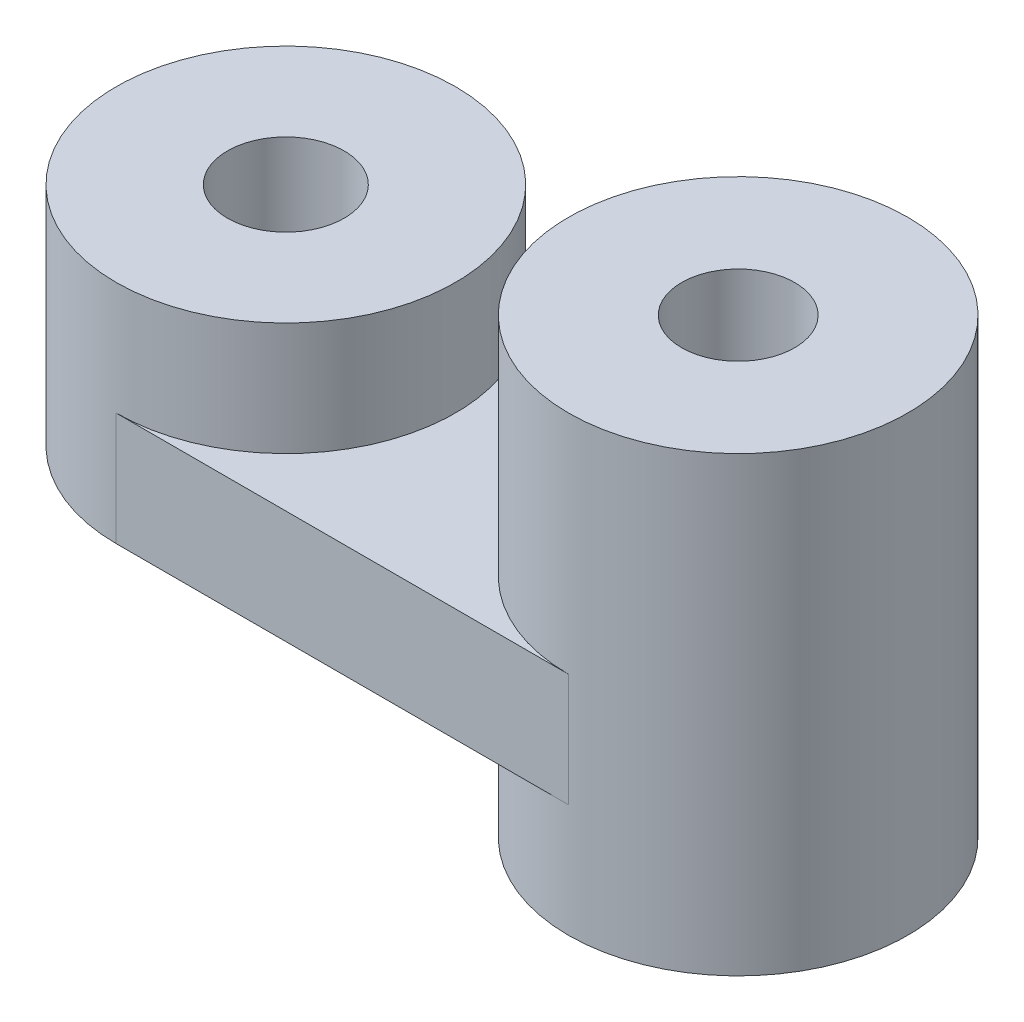
ISO-10303-21;
HEADER;
FILE_DESCRIPTION(('STEP AP214'),'2;1');
FILE_NAME('part.step','',(''),(''),'','','');
FILE_SCHEMA(('AUTOMOTIVE_DESIGN { 1 0 10303 214 1 1 1 1 }'));
ENDSEC;
DATA;
#1=APPLICATION_CONTEXT('core data for automotive mechanical design processes');
#2=APPLICATION_PROTOCOL_DEFINITION('international standard','automotive_design',2000,#1);
#3=PRODUCT_CONTEXT('',#1,'mechanical');
#4=PRODUCT('Part','Part','',(#3));
#5=PRODUCT_RELATED_PRODUCT_CATEGORY('part','',(#4));
#6=PRODUCT_DEFINITION_FORMATION('','',#4);
#7=PRODUCT_DEFINITION_CONTEXT('part definition',#1,'design');
#8=PRODUCT_DEFINITION('design','',#6,#7);
#9=PRODUCT_DEFINITION_SHAPE('','',#8);
#10=(LENGTH_UNIT() NAMED_UNIT(*) SI_UNIT(.MILLI.,.METRE.));
#11=(NAMED_UNIT(*) PLANE_ANGLE_UNIT() SI_UNIT($,.RADIAN.));
#12=(NAMED_UNIT(*) SI_UNIT($,.STERADIAN.) SOLID_ANGLE_UNIT());
#13=UNCERTAINTY_MEASURE_WITH_UNIT(LENGTH_MEASURE(1.E-05),#10,'distance_accuracy_value','');
#14=(GEOMETRIC_REPRESENTATION_CONTEXT(3) GLOBAL_UNCERTAINTY_ASSIGNED_CONTEXT((#13)) GLOBAL_UNIT_ASSIGNED_CONTEXT((#10,
#11,#12)) REPRESENTATION_CONTEXT('',''));
#15=CARTESIAN_POINT('',(0.,0.,0.));
#16=DIRECTION('',(0.,0.,1.));
#17=DIRECTION('',(1.,0.,0.));
#18=AXIS2_PLACEMENT_3D('',#15,#16,#17);
#19=CARTESIAN_POINT('',(0.,5.,0.));
#20=DIRECTION('',(0.,1.,0.));
#21=DIRECTION('',(0.,0.,1.));
#22=AXIS2_PLACEMENT_3D('',#19,#20,#21);
#23=PLANE('',#22);
#24=CARTESIAN_POINT('',(-10.,5.,0.));
#25=DIRECTION('',(0.,1.,0.));
#26=DIRECTION('',(0.,0.,1.));
#27=AXIS2_PLACEMENT_3D('',#24,#25,#26);
#28=CIRCLE('',#27,2.5);
#29=CARTESIAN_POINT('',(-10.,5.,2.5));
#30=VERTEX_POINT('',#29);
#31=EDGE_CURVE('E111',#30,#30,#28,.T.);
#32=ORIENTED_EDGE('',*,*,#31,.F.);
#33=EDGE_LOOP('',(#32));
#34=FACE_BOUND('',#33,.T.);
#35=CARTESIAN_POINT('',(-10.,5.,0.));
#36=DIRECTION('',(0.,1.,0.));
#37=DIRECTION('',(0.,0.,1.));
#38=AXIS2_PLACEMENT_3D('',#35,#36,#37);
#39=CIRCLE('',#38,2.58081611022788);
#40=CARTESIAN_POINT('',(-10.,5.,2.58081611022788));
#41=VERTEX_POINT('',#40);
#42=EDGE_CURVE('E144',#41,#41,#39,.T.);
#43=ORIENTED_EDGE('',*,*,#42,.T.);
#44=EDGE_LOOP('',(#43));
#45=FACE_BOUND('',#44,.T.);
#46=ADVANCED_FACE('F45',(#34,#45),#23,.T.);
#47=CARTESIAN_POINT('',(0.,5.,-7.5));
#48=DIRECTION('',(0.,0.,-1.));
#49=DIRECTION('',(-1.,0.,0.));
#50=AXIS2_PLACEMENT_3D('',#47,#48,#49);
#51=PLANE('',#50);
#52=DIRECTION('',(1.,0.,0.));
#53=VECTOR('',#52,1.);
#54=CARTESIAN_POINT('',(0.,0.,-7.5));
#55=LINE('',#54,#53);
#56=CARTESIAN_POINT('',(-10.,0.,-7.5));
#57=VERTEX_POINT('',#56);
#58=CARTESIAN_POINT('',(10.,0.,-7.5));
#59=VERTEX_POINT('',#58);
#60=EDGE_CURVE('E89',#57,#59,#55,.T.);
#61=ORIENTED_EDGE('',*,*,#60,.F.);
#62=DIRECTION('',(0.,-1.,0.));
#63=VECTOR('',#62,1.);
#64=CARTESIAN_POINT('',(-10.,5.,-7.5));
#65=LINE('',#64,#63);
#66=CARTESIAN_POINT('',(-10.,5.,-7.5));
#67=VERTEX_POINT('',#66);
#68=EDGE_CURVE('E55',#67,#57,#65,.T.);
#69=ORIENTED_EDGE('',*,*,#68,.F.);
#70=DIRECTION('',(1.,0.,0.));
#71=VECTOR('',#70,1.);
#72=CARTESIAN_POINT('',(0.,5.,-7.5));
#73=LINE('',#72,#71);
#74=CARTESIAN_POINT('',(10.,5.,-7.5));
#75=VERTEX_POINT('',#74);
#76=EDGE_CURVE('E134',#67,#75,#73,.T.);
#77=ORIENTED_EDGE('',*,*,#76,.T.);
#78=DIRECTION('',(0.,-1.,0.));
#79=VECTOR('',#78,1.);
#80=CARTESIAN_POINT('',(10.,5.,-7.5));
#81=LINE('',#80,#79);
#82=EDGE_CURVE('E106',#75,#59,#81,.T.);
#83=ORIENTED_EDGE('',*,*,#82,.T.);
#84=EDGE_LOOP('',(#61,#69,#77,#83));
#85=FACE_BOUND('',#84,.T.);
#86=ADVANCED_FACE('F47',(#85),#51,.T.);
#87=CARTESIAN_POINT('',(-10.,5.,0.));
#88=DIRECTION('',(0.,-1.,0.));
#89=DIRECTION('',(0.,0.,-1.));
#90=AXIS2_PLACEMENT_3D('',#87,#88,#89);
#91=CYLINDRICAL_SURFACE('',#90,7.5);
#92=CARTESIAN_POINT('',(-10.,0.,0.));
#93=DIRECTION('',(0.,1.,0.));
#94=DIRECTION('',(0.,0.,1.));
#95=AXIS2_PLACEMENT_3D('',#92,#93,#94);
#96=CIRCLE('',#95,7.5);
#97=CARTESIAN_POINT('',(-10.,0.,7.5));
#98=VERTEX_POINT('',#97);
#99=EDGE_CURVE('E77',#57,#98,#96,.T.);
#100=ORIENTED_EDGE('',*,*,#99,.T.);
#101=DIRECTION('',(0.,-1.,0.));
#102=VECTOR('',#101,1.);
#103=CARTESIAN_POINT('',(-10.,5.,7.5));
#104=LINE('',#103,#102);
#105=CARTESIAN_POINT('',(-10.,5.,7.5));
#106=VERTEX_POINT('',#105);
#107=EDGE_CURVE('E99',#106,#98,#104,.T.);
#108=ORIENTED_EDGE('',*,*,#107,.F.);
#109=CARTESIAN_POINT('',(-10.,5.,0.));
#110=DIRECTION('',(0.,1.,0.));
#111=DIRECTION('',(0.,0.,1.));
#112=AXIS2_PLACEMENT_3D('',#109,#110,#111);
#113=CIRCLE('',#112,7.5);
#114=EDGE_CURVE('E119',#106,#67,#113,.T.);
#115=ORIENTED_EDGE('',*,*,#114,.T.);
#116=ORIENTED_EDGE('',*,*,#68,.T.);
#117=EDGE_LOOP('',(#100,#108,#115,#116));
#118=FACE_BOUND('',#117,.T.);
#119=CARTESIAN_POINT('',(-10.,10.,0.));
#120=DIRECTION('',(0.,1.,0.));
#121=DIRECTION('',(0.,0.,1.));
#122=AXIS2_PLACEMENT_3D('',#119,#120,#121);
#123=CIRCLE('',#122,7.5);
#124=CARTESIAN_POINT('',(-10.,10.,7.5));
#125=VERTEX_POINT('',#124);
#126=EDGE_CURVE('E125',#125,#125,#123,.T.);
#127=ORIENTED_EDGE('',*,*,#126,.F.);
#128=EDGE_LOOP('',(#127));
#129=FACE_BOUND('',#128,.T.);
#130=ADVANCED_FACE('F116',(#118,#129),#91,.T.);
#131=CARTESIAN_POINT('',(0.,5.,7.5));
#132=DIRECTION('',(0.,0.,-1.));
#133=DIRECTION('',(-1.,0.,0.));
#134=AXIS2_PLACEMENT_3D('',#131,#132,#133);
#135=PLANE('',#134);
#136=DIRECTION('',(1.,0.,0.));
#137=VECTOR('',#136,1.);
#138=CARTESIAN_POINT('',(0.,0.,7.5));
#139=LINE('',#138,#137);
#140=CARTESIAN_POINT('',(10.,0.,7.5));
#141=VERTEX_POINT('',#140);
#142=EDGE_CURVE('E86',#98,#141,#139,.T.);
#143=ORIENTED_EDGE('',*,*,#142,.T.);
#144=DIRECTION('',(0.,-1.,0.));
#145=VECTOR('',#144,1.);
#146=CARTESIAN_POINT('',(10.,5.,7.5));
#147=LINE('',#146,#145);
#148=CARTESIAN_POINT('',(10.,5.,7.5));
#149=VERTEX_POINT('',#148);
#150=EDGE_CURVE('E98',#149,#141,#147,.T.);
#151=ORIENTED_EDGE('',*,*,#150,.F.);
#152=DIRECTION('',(1.,0.,0.));
#153=VECTOR('',#152,1.);
#154=CARTESIAN_POINT('',(0.,5.,7.5));
#155=LINE('',#154,#153);
#156=EDGE_CURVE('E137',#106,#149,#155,.T.);
#157=ORIENTED_EDGE('',*,*,#156,.F.);
#158=ORIENTED_EDGE('',*,*,#107,.T.);
#159=EDGE_LOOP('',(#143,#151,#157,#158));
#160=FACE_BOUND('',#159,.T.);
#161=ADVANCED_FACE('F95',(#160),#135,.F.);
#162=CARTESIAN_POINT('',(10.,5.,0.));
#163=DIRECTION('',(0.,-1.,0.));
#164=DIRECTION('',(0.,0.,-1.));
#165=AXIS2_PLACEMENT_3D('',#162,#163,#164);
#166=CYLINDRICAL_SURFACE('',#165,7.5);
#167=ORIENTED_EDGE('',*,*,#150,.T.);
#168=CARTESIAN_POINT('',(10.,0.,0.));
#169=DIRECTION('',(0.,1.,0.));
#170=DIRECTION('',(0.,0.,1.));
#171=AXIS2_PLACEMENT_3D('',#168,#169,#170);
#172=CIRCLE('',#171,7.5);
#173=EDGE_CURVE('E11',#59,#141,#172,.T.);
#174=ORIENTED_EDGE('',*,*,#173,.F.);
#175=ORIENTED_EDGE('',*,*,#82,.F.);
#176=CARTESIAN_POINT('',(10.,5.,0.));
#177=DIRECTION('',(0.,1.,0.));
#178=DIRECTION('',(0.,0.,1.));
#179=AXIS2_PLACEMENT_3D('',#176,#177,#178);
#180=CIRCLE('',#179,7.5);
#181=EDGE_CURVE('E63',#75,#149,#180,.T.);
#182=ORIENTED_EDGE('',*,*,#181,.T.);
#183=EDGE_LOOP('',(#167,#174,#175,#182));
#184=FACE_BOUND('',#183,.T.);
#185=CARTESIAN_POINT('',(10.,-5.,0.));
#186=DIRECTION('',(0.,1.,0.));
#187=DIRECTION('',(0.,0.,1.));
#188=AXIS2_PLACEMENT_3D('',#185,#186,#187);
#189=CIRCLE('',#188,7.5);
#190=CARTESIAN_POINT('',(10.,-5.,7.5));
#191=VERTEX_POINT('',#190);
#192=EDGE_CURVE('E153',#191,#191,#189,.T.);
#193=ORIENTED_EDGE('',*,*,#192,.T.);
#194=EDGE_LOOP('',(#193));
#195=FACE_BOUND('',#194,.T.);
#196=CARTESIAN_POINT('',(10.,15.,0.));
#197=DIRECTION('',(0.,1.,0.));
#198=DIRECTION('',(0.,0.,1.));
#199=AXIS2_PLACEMENT_3D('',#196,#197,#198);
#200=CIRCLE('',#199,7.5);
#201=CARTESIAN_POINT('',(10.,15.,7.5));
#202=VERTEX_POINT('',#201);
#203=EDGE_CURVE('E161',#202,#202,#200,.T.);
#204=ORIENTED_EDGE('',*,*,#203,.F.);
#205=EDGE_LOOP('',(#204));
#206=FACE_BOUND('',#205,.T.);
#207=ADVANCED_FACE('F103',(#184,#195,#206),#166,.T.);
#208=CARTESIAN_POINT('',(-10.,5.,0.));
#209=DIRECTION('',(0.,-1.,0.));
#210=DIRECTION('',(0.,0.,-1.));
#211=AXIS2_PLACEMENT_3D('',#208,#209,#210);
#212=CYLINDRICAL_SURFACE('',#211,2.5);
#213=ORIENTED_EDGE('',*,*,#31,.T.);
#214=EDGE_LOOP('',(#213));
#215=FACE_BOUND('',#214,.T.);
#216=CARTESIAN_POINT('',(-10.,0.,0.));
#217=DIRECTION('',(0.,1.,0.));
#218=DIRECTION('',(0.,0.,1.));
#219=AXIS2_PLACEMENT_3D('',#216,#217,#218);
#220=CIRCLE('',#219,2.5);
#221=CARTESIAN_POINT('',(-10.,0.,2.5));
#222=VERTEX_POINT('',#221);
#223=EDGE_CURVE('E101',#222,#222,#220,.T.);
#224=ORIENTED_EDGE('',*,*,#223,.F.);
#225=EDGE_LOOP('',(#224));
#226=FACE_BOUND('',#225,.T.);
#227=ADVANCED_FACE('F195',(#215,#226),#212,.F.);
#228=ORIENTED_EDGE('',*,*,#181,.F.);
#229=ORIENTED_EDGE('',*,*,#76,.F.);
#230=ORIENTED_EDGE('',*,*,#114,.F.);
#231=ORIENTED_EDGE('',*,*,#156,.T.);
#232=EDGE_LOOP('',(#228,#229,#230,#231));
#233=FACE_BOUND('',#232,.T.);
#234=ADVANCED_FACE('F186',(#233),#23,.T.);
#235=CARTESIAN_POINT('',(0.,0.,0.));
#236=DIRECTION('',(0.,1.,0.));
#237=DIRECTION('',(0.,0.,1.));
#238=AXIS2_PLACEMENT_3D('',#235,#236,#237);
#239=PLANE('',#238);
#240=ORIENTED_EDGE('',*,*,#60,.T.);
#241=ORIENTED_EDGE('',*,*,#173,.T.);
#242=ORIENTED_EDGE('',*,*,#142,.F.);
#243=ORIENTED_EDGE('',*,*,#99,.F.);
#244=EDGE_LOOP('',(#240,#241,#242,#243));
#245=FACE_BOUND('',#244,.T.);
#246=ORIENTED_EDGE('',*,*,#223,.T.);
#247=EDGE_LOOP('',(#246));
#248=FACE_BOUND('',#247,.T.);
#249=ADVANCED_FACE('F84',(#245,#248),#239,.F.);
#250=CARTESIAN_POINT('',(-10.,10.,0.));
#251=DIRECTION('',(0.,1.,0.));
#252=DIRECTION('',(0.,0.,1.));
#253=AXIS2_PLACEMENT_3D('',#250,#251,#252);
#254=PLANE('',#253);
#255=ORIENTED_EDGE('',*,*,#126,.T.);
#256=EDGE_LOOP('',(#255));
#257=FACE_BOUND('',#256,.T.);
#258=CARTESIAN_POINT('',(-10.,10.,0.));
#259=DIRECTION('',(0.,1.,0.));
#260=DIRECTION('',(0.,0.,1.));
#261=AXIS2_PLACEMENT_3D('',#258,#259,#260);
#262=CIRCLE('',#261,2.58081611022788);
#263=CARTESIAN_POINT('',(-10.,10.,2.58081611022788));
#264=VERTEX_POINT('',#263);
#265=EDGE_CURVE('E142',#264,#264,#262,.T.);
#266=ORIENTED_EDGE('',*,*,#265,.F.);
#267=EDGE_LOOP('',(#266));
#268=FACE_BOUND('',#267,.T.);
#269=ADVANCED_FACE('F200',(#257,#268),#254,.T.);
#270=CARTESIAN_POINT('',(-10.,10.,0.));
#271=DIRECTION('',(0.,-1.,0.));
#272=DIRECTION('',(0.,0.,-1.));
#273=AXIS2_PLACEMENT_3D('',#270,#271,#272);
#274=CYLINDRICAL_SURFACE('',#273,2.58081611022788);
#275=ORIENTED_EDGE('',*,*,#265,.T.);
#276=EDGE_LOOP('',(#275));
#277=FACE_BOUND('',#276,.T.);
#278=ORIENTED_EDGE('',*,*,#42,.F.);
#279=EDGE_LOOP('',(#278));
#280=FACE_BOUND('',#279,.T.);
#281=ADVANCED_FACE('F251',(#277,#280),#274,.F.);
#282=CARTESIAN_POINT('',(10.,-5.,0.));
#283=DIRECTION('',(0.,1.,0.));
#284=DIRECTION('',(0.,0.,1.));
#285=AXIS2_PLACEMENT_3D('',#282,#283,#284);
#286=PLANE('',#285);
#287=CARTESIAN_POINT('',(10.,-5.,0.));
#288=DIRECTION('',(0.,1.,0.));
#289=DIRECTION('',(0.,0.,1.));
#290=AXIS2_PLACEMENT_3D('',#287,#288,#289);
#291=CIRCLE('',#290,2.5);
#292=CARTESIAN_POINT('',(10.,-5.,2.5));
#293=VERTEX_POINT('',#292);
#294=EDGE_CURVE('E157',#293,#293,#291,.T.);
#295=ORIENTED_EDGE('',*,*,#294,.T.);
#296=EDGE_LOOP('',(#295));
#297=FACE_BOUND('',#296,.T.);
#298=ORIENTED_EDGE('',*,*,#192,.F.);
#299=EDGE_LOOP('',(#298));
#300=FACE_BOUND('',#299,.T.);
#301=ADVANCED_FACE('F179',(#297,#300),#286,.F.);
#302=CARTESIAN_POINT('',(10.,5.,0.));
#303=DIRECTION('',(0.,-1.,0.));
#304=DIRECTION('',(0.,0.,-1.));
#305=AXIS2_PLACEMENT_3D('',#302,#303,#304);
#306=CYLINDRICAL_SURFACE('',#305,2.5);
#307=ORIENTED_EDGE('',*,*,#294,.F.);
#308=EDGE_LOOP('',(#307));
#309=FACE_BOUND('',#308,.T.);
#310=CARTESIAN_POINT('',(10.,15.,0.));
#311=DIRECTION('',(0.,1.,0.));
#312=DIRECTION('',(0.,0.,1.));
#313=AXIS2_PLACEMENT_3D('',#310,#311,#312);
#314=CIRCLE('',#313,2.5);
#315=CARTESIAN_POINT('',(10.,15.,2.5));
#316=VERTEX_POINT('',#315);
#317=EDGE_CURVE('E165',#316,#316,#314,.T.);
#318=ORIENTED_EDGE('',*,*,#317,.T.);
#319=EDGE_LOOP('',(#318));
#320=FACE_BOUND('',#319,.T.);
#321=ADVANCED_FACE('F170',(#309,#320),#306,.F.);
#322=CARTESIAN_POINT('',(10.,15.,0.));
#323=DIRECTION('',(0.,1.,0.));
#324=DIRECTION('',(0.,0.,1.));
#325=AXIS2_PLACEMENT_3D('',#322,#323,#324);
#326=PLANE('',#325);
#327=ORIENTED_EDGE('',*,*,#203,.T.);
#328=EDGE_LOOP('',(#327));
#329=FACE_BOUND('',#328,.T.);
#330=ORIENTED_EDGE('',*,*,#317,.F.);
#331=EDGE_LOOP('',(#330));
#332=FACE_BOUND('',#331,.T.);
#333=ADVANCED_FACE('F172',(#329,#332),#326,.T.);
#334=CLOSED_SHELL('',(#46,#86,#130,#161,#207,#227,#234,#249,#269,#281,#301,#321,#333));
#335=MANIFOLD_SOLID_BREP('B2',#334);
#336=ADVANCED_BREP_SHAPE_REPRESENTATION('',(#18,#335),#14);
#337=SHAPE_DEFINITION_REPRESENTATION(#9,#336);
ENDSEC;
END-ISO-10303-21;
